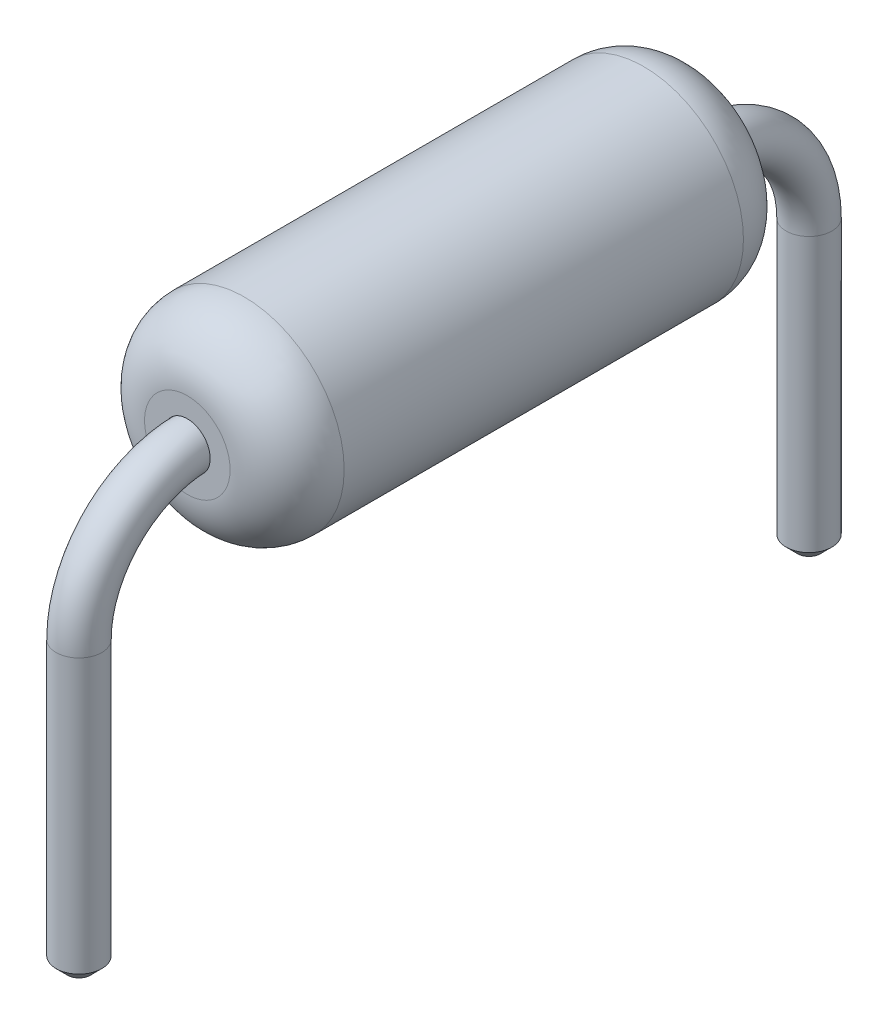
ISO-10303-21;
HEADER;
FILE_DESCRIPTION(('STEP AP214'),'2;1');
FILE_NAME('part.step','',(''),(''),'','','');
FILE_SCHEMA(('AUTOMOTIVE_DESIGN { 1 0 10303 214 1 1 1 1 }'));
ENDSEC;
DATA;
#1=APPLICATION_CONTEXT('core data for automotive mechanical design processes');
#2=APPLICATION_PROTOCOL_DEFINITION('international standard','automotive_design',2000,#1);
#3=PRODUCT_CONTEXT('',#1,'mechanical');
#4=PRODUCT('Part','Part','',(#3));
#5=PRODUCT_RELATED_PRODUCT_CATEGORY('part','',(#4));
#6=PRODUCT_DEFINITION_FORMATION('','',#4);
#7=PRODUCT_DEFINITION_CONTEXT('part definition',#1,'design');
#8=PRODUCT_DEFINITION('design','',#6,#7);
#9=PRODUCT_DEFINITION_SHAPE('','',#8);
#10=(LENGTH_UNIT() NAMED_UNIT(*) SI_UNIT(.MILLI.,.METRE.));
#11=(NAMED_UNIT(*) PLANE_ANGLE_UNIT() SI_UNIT($,.RADIAN.));
#12=(NAMED_UNIT(*) SI_UNIT($,.STERADIAN.) SOLID_ANGLE_UNIT());
#13=UNCERTAINTY_MEASURE_WITH_UNIT(LENGTH_MEASURE(1.E-05),#10,'distance_accuracy_value','');
#14=(GEOMETRIC_REPRESENTATION_CONTEXT(3) GLOBAL_UNCERTAINTY_ASSIGNED_CONTEXT((#13)) GLOBAL_UNIT_ASSIGNED_CONTEXT((#10,
#11,#12)) REPRESENTATION_CONTEXT('',''));
#15=CARTESIAN_POINT('',(0.,0.,0.));
#16=DIRECTION('',(0.,0.,1.));
#17=DIRECTION('',(1.,0.,0.));
#18=AXIS2_PLACEMENT_3D('',#15,#16,#17);
#19=CARTESIAN_POINT('',(0.,4.,4.5));
#20=DIRECTION('',(0.,0.,1.));
#21=DIRECTION('',(1.,0.,0.));
#22=AXIS2_PLACEMENT_3D('',#19,#20,#21);
#23=PLANE('',#22);
#24=CARTESIAN_POINT('',(0.,4.,4.5));
#25=DIRECTION('',(0.,0.,1.));
#26=DIRECTION('',(1.,0.,0.));
#27=AXIS2_PLACEMENT_3D('',#24,#25,#26);
#28=CIRCLE('',#27,0.75);
#29=CARTESIAN_POINT('',(0.75,4.,4.5));
#30=VERTEX_POINT('',#29);
#31=EDGE_CURVE('E11',#30,#30,#28,.T.);
#32=ORIENTED_EDGE('',*,*,#31,.T.);
#33=EDGE_LOOP('',(#32));
#34=FACE_BOUND('',#33,.T.);
#35=CARTESIAN_POINT('',(0.,4.,4.5));
#36=DIRECTION('',(0.,0.,1.));
#37=DIRECTION('',(1.,0.,0.));
#38=AXIS2_PLACEMENT_3D('',#35,#36,#37);
#39=CIRCLE('',#38,0.4);
#40=CARTESIAN_POINT('',(0.4,4.,4.5));
#41=VERTEX_POINT('',#40);
#42=EDGE_CURVE('E61',#41,#41,#39,.T.);
#43=ORIENTED_EDGE('',*,*,#42,.F.);
#44=EDGE_LOOP('',(#43));
#45=FACE_BOUND('',#44,.T.);
#46=ADVANCED_FACE('F41',(#34,#45),#23,.T.);
#47=CARTESIAN_POINT('',(0.,4.,-4.5));
#48=DIRECTION('',(0.,0.,1.));
#49=DIRECTION('',(1.,0.,0.));
#50=AXIS2_PLACEMENT_3D('',#47,#48,#49);
#51=PLANE('',#50);
#52=CARTESIAN_POINT('',(0.,4.,-4.5));
#53=DIRECTION('',(0.,0.,1.));
#54=DIRECTION('',(1.,0.,0.));
#55=AXIS2_PLACEMENT_3D('',#52,#53,#54);
#56=CIRCLE('',#55,0.75);
#57=CARTESIAN_POINT('',(0.75,4.,-4.5));
#58=VERTEX_POINT('',#57);
#59=EDGE_CURVE('E48',#58,#58,#56,.F.);
#60=ORIENTED_EDGE('',*,*,#59,.T.);
#61=EDGE_LOOP('',(#60));
#62=FACE_BOUND('',#61,.T.);
#63=CARTESIAN_POINT('',(0.,4.,-4.5));
#64=DIRECTION('',(0.,0.,1.));
#65=DIRECTION('',(1.,0.,0.));
#66=AXIS2_PLACEMENT_3D('',#63,#64,#65);
#67=CIRCLE('',#66,0.4);
#68=CARTESIAN_POINT('',(0.4,4.,-4.5));
#69=VERTEX_POINT('',#68);
#70=EDGE_CURVE('E62',#69,#69,#67,.T.);
#71=ORIENTED_EDGE('',*,*,#70,.T.);
#72=EDGE_LOOP('',(#71));
#73=FACE_BOUND('',#72,.T.);
#74=ADVANCED_FACE('F72',(#62,#73),#51,.F.);
#75=CARTESIAN_POINT('',(0.,4.,4.5));
#76=DIRECTION('',(0.,0.,-1.));
#77=DIRECTION('',(-1.,0.,0.));
#78=AXIS2_PLACEMENT_3D('',#75,#76,#77);
#79=CYLINDRICAL_SURFACE('',#78,1.75);
#80=CARTESIAN_POINT('',(0.,4.,-3.5));
#81=DIRECTION('',(0.,0.,1.));
#82=DIRECTION('',(1.,0.,0.));
#83=AXIS2_PLACEMENT_3D('',#80,#81,#82);
#84=CIRCLE('',#83,1.75);
#85=CARTESIAN_POINT('',(1.75,4.,-3.5));
#86=VERTEX_POINT('',#85);
#87=EDGE_CURVE('E52',#86,#86,#84,.T.);
#88=ORIENTED_EDGE('',*,*,#87,.T.);
#89=EDGE_LOOP('',(#88));
#90=FACE_BOUND('',#89,.T.);
#91=CARTESIAN_POINT('',(0.,4.,3.5));
#92=DIRECTION('',(0.,0.,1.));
#93=DIRECTION('',(1.,0.,0.));
#94=AXIS2_PLACEMENT_3D('',#91,#92,#93);
#95=CIRCLE('',#94,1.75);
#96=CARTESIAN_POINT('',(1.75,4.,3.5));
#97=VERTEX_POINT('',#96);
#98=EDGE_CURVE('E56',#97,#97,#95,.F.);
#99=ORIENTED_EDGE('',*,*,#98,.T.);
#100=EDGE_LOOP('',(#99));
#101=FACE_BOUND('',#100,.T.);
#102=ADVANCED_FACE('F77',(#90,#101),#79,.T.);
#103=CARTESIAN_POINT('',(0.,4.,4.5));
#104=DIRECTION('',(0.,0.,-1.));
#105=DIRECTION('',(-1.,0.,0.));
#106=AXIS2_PLACEMENT_3D('',#103,#104,#105);
#107=CYLINDRICAL_SURFACE('',#106,0.4);
#108=ORIENTED_EDGE('',*,*,#42,.T.);
#109=EDGE_LOOP('',(#108));
#110=FACE_BOUND('',#109,.T.);
#111=ORIENTED_EDGE('',*,*,#70,.F.);
#112=EDGE_LOOP('',(#111));
#113=FACE_BOUND('',#112,.T.);
#114=ADVANCED_FACE('F68',(#110,#113),#107,.F.);
#115=CARTESIAN_POINT('',(0.,4.,-3.5));
#116=DIRECTION('',(0.,0.,1.));
#117=DIRECTION('',(1.,0.,0.));
#118=AXIS2_PLACEMENT_3D('',#115,#116,#117);
#119=DEGENERATE_TOROIDAL_SURFACE('',#118,0.75,1.,.T.);
#120=ORIENTED_EDGE('',*,*,#59,.F.);
#121=EDGE_LOOP('',(#120));
#122=FACE_BOUND('',#121,.T.);
#123=ORIENTED_EDGE('',*,*,#87,.F.);
#124=EDGE_LOOP('',(#123));
#125=FACE_BOUND('',#124,.T.);
#126=ADVANCED_FACE('F83',(#122,#125),#119,.T.);
#127=CARTESIAN_POINT('',(0.,4.,3.5));
#128=DIRECTION('',(0.,0.,1.));
#129=DIRECTION('',(1.,0.,0.));
#130=AXIS2_PLACEMENT_3D('',#127,#128,#129);
#131=DEGENERATE_TOROIDAL_SURFACE('',#130,0.75,1.,.T.);
#132=ORIENTED_EDGE('',*,*,#98,.F.);
#133=EDGE_LOOP('',(#132));
#134=FACE_BOUND('',#133,.T.);
#135=ORIENTED_EDGE('',*,*,#31,.F.);
#136=EDGE_LOOP('',(#135));
#137=FACE_BOUND('',#136,.T.);
#138=ADVANCED_FACE('F43',(#134,#137),#131,.T.);
#139=CLOSED_SHELL('',(#46,#74,#102,#114,#126,#138));
#140=MANIFOLD_SOLID_BREP('B2',#139);
#141=CARTESIAN_POINT('',(0.,-3.,6.4));
#142=DIRECTION('',(0.,1.,0.));
#143=DIRECTION('',(0.,0.,1.));
#144=AXIS2_PLACEMENT_3D('',#141,#142,#143);
#145=PLANE('',#144);
#146=CARTESIAN_POINT('',(0.,-3.,6.4));
#147=DIRECTION('',(0.,1.,0.));
#148=DIRECTION('',(0.,0.,1.));
#149=AXIS2_PLACEMENT_3D('',#146,#147,#148);
#150=CIRCLE('',#149,0.200000000000001);
#151=CARTESIAN_POINT('',(0.,-3.,6.6));
#152=VERTEX_POINT('',#151);
#153=EDGE_CURVE('E144',#152,#152,#150,.F.);
#154=ORIENTED_EDGE('',*,*,#153,.T.);
#155=EDGE_LOOP('',(#154));
#156=FACE_BOUND('',#155,.T.);
#157=ADVANCED_FACE('F133',(#156),#145,.F.);
#158=CARTESIAN_POINT('',(0.,-3.,-6.4));
#159=DIRECTION('',(0.,-1.,0.));
#160=DIRECTION('',(0.,0.,-1.));
#161=AXIS2_PLACEMENT_3D('',#158,#159,#160);
#162=PLANE('',#161);
#163=CARTESIAN_POINT('',(0.,-3.,-6.4));
#164=DIRECTION('',(0.,-1.,0.));
#165=DIRECTION('',(0.,0.,-1.));
#166=AXIS2_PLACEMENT_3D('',#163,#164,#165);
#167=CIRCLE('',#166,0.200000000000001);
#168=CARTESIAN_POINT('',(0.,-3.,-6.6));
#169=VERTEX_POINT('',#168);
#170=EDGE_CURVE('E140',#169,#169,#167,.T.);
#171=ORIENTED_EDGE('',*,*,#170,.T.);
#172=EDGE_LOOP('',(#171));
#173=FACE_BOUND('',#172,.T.);
#174=ADVANCED_FACE('F170',(#173),#162,.T.);
#175=CARTESIAN_POINT('',(0.,-3.,6.4));
#176=DIRECTION('',(0.,1.,0.));
#177=DIRECTION('',(0.,0.,1.));
#178=AXIS2_PLACEMENT_3D('',#175,#176,#177);
#179=CYLINDRICAL_SURFACE('',#178,0.4);
#180=CARTESIAN_POINT('',(0.,-2.8,6.4));
#181=DIRECTION('',(0.,1.,0.));
#182=DIRECTION('',(0.,0.,1.));
#183=AXIS2_PLACEMENT_3D('',#180,#181,#182);
#184=CIRCLE('',#183,0.4);
#185=CARTESIAN_POINT('',(0.,-2.8,6.8));
#186=VERTEX_POINT('',#185);
#187=EDGE_CURVE('E148',#186,#186,#184,.T.);
#188=ORIENTED_EDGE('',*,*,#187,.T.);
#189=EDGE_LOOP('',(#188));
#190=FACE_BOUND('',#189,.T.);
#191=CARTESIAN_POINT('',(0.,2.,6.4));
#192=DIRECTION('',(0.,1.,0.));
#193=DIRECTION('',(0.,0.,1.));
#194=AXIS2_PLACEMENT_3D('',#191,#192,#193);
#195=CIRCLE('',#194,0.4);
#196=CARTESIAN_POINT('',(0.,2.,6.8));
#197=VERTEX_POINT('',#196);
#198=EDGE_CURVE('E162',#197,#197,#195,.T.);
#199=ORIENTED_EDGE('',*,*,#198,.F.);
#200=EDGE_LOOP('',(#199));
#201=FACE_BOUND('',#200,.T.);
#202=ADVANCED_FACE('F168',(#190,#201),#179,.T.);
#203=CARTESIAN_POINT('',(0.,2.,4.4));
#204=DIRECTION('',(-1.,0.,0.));
#205=DIRECTION('',(0.,0.,1.));
#206=AXIS2_PLACEMENT_3D('',#203,#204,#205);
#207=TOROIDAL_SURFACE('',#206,2.,0.4);
#208=CARTESIAN_POINT('',(0.,4.,4.4));
#209=DIRECTION('',(0.,0.,-1.));
#210=DIRECTION('',(0.,1.,0.));
#211=AXIS2_PLACEMENT_3D('',#208,#209,#210);
#212=CIRCLE('',#211,0.4);
#213=CARTESIAN_POINT('',(0.,4.4,4.4));
#214=VERTEX_POINT('',#213);
#215=EDGE_CURVE('E159',#214,#214,#212,.T.);
#216=CARTESIAN_POINT('',(0.,2.,4.4));
#217=DIRECTION('',(-1.,0.,0.));
#218=DIRECTION('',(0.,0.,1.));
#219=AXIS2_PLACEMENT_3D('',#216,#217,#218);
#220=CIRCLE('',#219,2.4);
#221=EDGE_CURVE('',#197,#214,#220,.T.);
#222=ORIENTED_EDGE('',*,*,#198,.T.);
#223=ORIENTED_EDGE('',*,*,#215,.F.);
#224=ORIENTED_EDGE('',*,*,#221,.T.);
#225=ORIENTED_EDGE('',*,*,#221,.F.);
#226=EDGE_LOOP('',(#222,#224,#223,#225));
#227=FACE_BOUND('',#226,.T.);
#228=ADVANCED_FACE('F166',(#227),#207,.T.);
#229=CARTESIAN_POINT('',(0.,4.,4.4));
#230=DIRECTION('',(0.,0.,-1.));
#231=DIRECTION('',(-1.,0.,0.));
#232=AXIS2_PLACEMENT_3D('',#229,#230,#231);
#233=CYLINDRICAL_SURFACE('',#232,0.4);
#234=CARTESIAN_POINT('',(0.,4.,-4.4));
#235=DIRECTION('',(0.,0.,-1.));
#236=DIRECTION('',(0.,1.,0.));
#237=AXIS2_PLACEMENT_3D('',#234,#235,#236);
#238=CIRCLE('',#237,0.4);
#239=CARTESIAN_POINT('',(0.,4.4,-4.4));
#240=VERTEX_POINT('',#239);
#241=EDGE_CURVE('E156',#240,#240,#238,.T.);
#242=ORIENTED_EDGE('',*,*,#241,.F.);
#243=EDGE_LOOP('',(#242));
#244=FACE_BOUND('',#243,.T.);
#245=ORIENTED_EDGE('',*,*,#215,.T.);
#246=EDGE_LOOP('',(#245));
#247=FACE_BOUND('',#246,.T.);
#248=ADVANCED_FACE('F177',(#244,#247),#233,.T.);
#249=CARTESIAN_POINT('',(0.,2.,-4.4));
#250=DIRECTION('',(-1.,0.,0.));
#251=DIRECTION('',(0.,0.,1.));
#252=AXIS2_PLACEMENT_3D('',#249,#250,#251);
#253=TOROIDAL_SURFACE('',#252,2.,0.4);
#254=CARTESIAN_POINT('',(0.,2.,-6.4));
#255=DIRECTION('',(0.,-1.,0.));
#256=DIRECTION('',(0.,0.,-1.));
#257=AXIS2_PLACEMENT_3D('',#254,#255,#256);
#258=CIRCLE('',#257,0.4);
#259=CARTESIAN_POINT('',(0.,2.,-6.8));
#260=VERTEX_POINT('',#259);
#261=EDGE_CURVE('E153',#260,#260,#258,.T.);
#262=CARTESIAN_POINT('',(0.,2.,-4.4));
#263=DIRECTION('',(-1.,0.,0.));
#264=DIRECTION('',(0.,0.,1.));
#265=AXIS2_PLACEMENT_3D('',#262,#263,#264);
#266=CIRCLE('',#265,2.4);
#267=EDGE_CURVE('',#240,#260,#266,.T.);
#268=ORIENTED_EDGE('',*,*,#241,.T.);
#269=ORIENTED_EDGE('',*,*,#261,.F.);
#270=ORIENTED_EDGE('',*,*,#267,.T.);
#271=ORIENTED_EDGE('',*,*,#267,.F.);
#272=EDGE_LOOP('',(#268,#270,#269,#271));
#273=FACE_BOUND('',#272,.T.);
#274=ADVANCED_FACE('F184',(#273),#253,.T.);
#275=CARTESIAN_POINT('',(0.,2.,-6.4));
#276=DIRECTION('',(0.,-1.,0.));
#277=DIRECTION('',(0.,0.,-1.));
#278=AXIS2_PLACEMENT_3D('',#275,#276,#277);
#279=CYLINDRICAL_SURFACE('',#278,0.4);
#280=CARTESIAN_POINT('',(0.,-2.8,-6.4));
#281=DIRECTION('',(0.,-1.,0.));
#282=DIRECTION('',(0.,0.,-1.));
#283=AXIS2_PLACEMENT_3D('',#280,#281,#282);
#284=CIRCLE('',#283,0.4);
#285=CARTESIAN_POINT('',(0.,-2.8,-6.8));
#286=VERTEX_POINT('',#285);
#287=EDGE_CURVE('E40',#286,#286,#284,.F.);
#288=ORIENTED_EDGE('',*,*,#287,.T.);
#289=EDGE_LOOP('',(#288));
#290=FACE_BOUND('',#289,.T.);
#291=ORIENTED_EDGE('',*,*,#261,.T.);
#292=EDGE_LOOP('',(#291));
#293=FACE_BOUND('',#292,.T.);
#294=ADVANCED_FACE('F181',(#290,#293),#279,.T.);
#295=CARTESIAN_POINT('',(0.,-2.8,6.4));
#296=DIRECTION('',(0.,1.,0.));
#297=DIRECTION('',(0.,0.,1.));
#298=AXIS2_PLACEMENT_3D('',#295,#296,#297);
#299=CONICAL_SURFACE('',#298,0.4,0.785398163397449);
#300=ORIENTED_EDGE('',*,*,#153,.F.);
#301=EDGE_LOOP('',(#300));
#302=FACE_BOUND('',#301,.T.);
#303=ORIENTED_EDGE('',*,*,#187,.F.);
#304=EDGE_LOOP('',(#303));
#305=FACE_BOUND('',#304,.T.);
#306=ADVANCED_FACE('F183',(#302,#305),#299,.T.);
#307=CARTESIAN_POINT('',(0.,-3.,-6.4));
#308=DIRECTION('',(0.,1.,0.));
#309=DIRECTION('',(0.,0.,1.));
#310=AXIS2_PLACEMENT_3D('',#307,#308,#309);
#311=CONICAL_SURFACE('',#310,0.200000000000001,0.785398163397441);
#312=ORIENTED_EDGE('',*,*,#287,.F.);
#313=EDGE_LOOP('',(#312));
#314=FACE_BOUND('',#313,.T.);
#315=ORIENTED_EDGE('',*,*,#170,.F.);
#316=EDGE_LOOP('',(#315));
#317=FACE_BOUND('',#316,.T.);
#318=ADVANCED_FACE('F135',(#314,#317),#311,.T.);
#319=CLOSED_SHELL('',(#157,#174,#202,#228,#248,#274,#294,#306,#318));
#320=MANIFOLD_SOLID_BREP('B6',#319);
#321=ADVANCED_BREP_SHAPE_REPRESENTATION('',(#18,#140,#320),#14);
#322=SHAPE_DEFINITION_REPRESENTATION(#9,#321);
ENDSEC;
END-ISO-10303-21;
